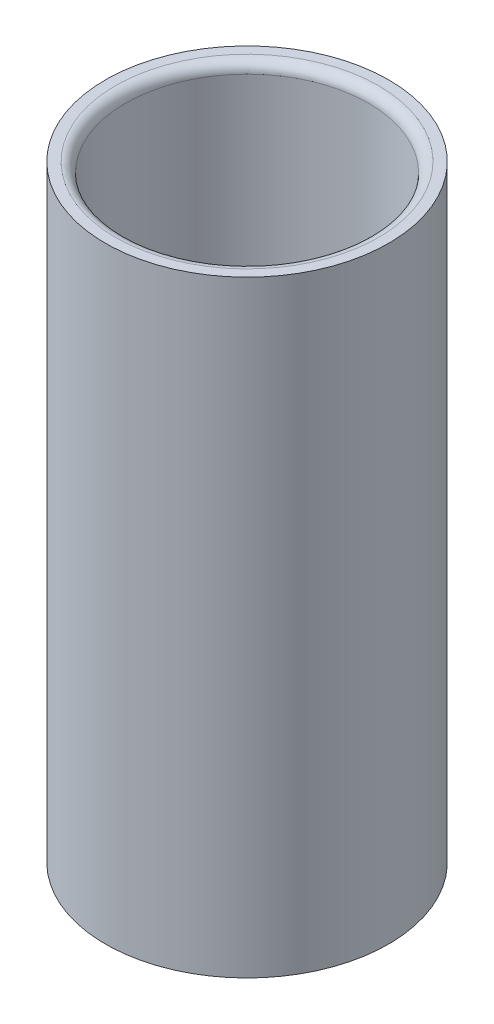
ISO-10303-21;
HEADER;
FILE_DESCRIPTION(('STEP AP214'),'2;1');
FILE_NAME('part.step','',(''),(''),'','','');
FILE_SCHEMA(('AUTOMOTIVE_DESIGN { 1 0 10303 214 1 1 1 1 }'));
ENDSEC;
DATA;
#1=APPLICATION_CONTEXT('core data for automotive mechanical design processes');
#2=APPLICATION_PROTOCOL_DEFINITION('international standard','automotive_design',2000,#1);
#3=PRODUCT_CONTEXT('',#1,'mechanical');
#4=PRODUCT('Part','Part','',(#3));
#5=PRODUCT_RELATED_PRODUCT_CATEGORY('part','',(#4));
#6=PRODUCT_DEFINITION_FORMATION('','',#4);
#7=PRODUCT_DEFINITION_CONTEXT('part definition',#1,'design');
#8=PRODUCT_DEFINITION('design','',#6,#7);
#9=PRODUCT_DEFINITION_SHAPE('','',#8);
#10=(LENGTH_UNIT() NAMED_UNIT(*) SI_UNIT(.MILLI.,.METRE.));
#11=(NAMED_UNIT(*) PLANE_ANGLE_UNIT() SI_UNIT($,.RADIAN.));
#12=(NAMED_UNIT(*) SI_UNIT($,.STERADIAN.) SOLID_ANGLE_UNIT());
#13=UNCERTAINTY_MEASURE_WITH_UNIT(LENGTH_MEASURE(1.E-05),#10,'distance_accuracy_value','');
#14=(GEOMETRIC_REPRESENTATION_CONTEXT(3) GLOBAL_UNCERTAINTY_ASSIGNED_CONTEXT((#13)) GLOBAL_UNIT_ASSIGNED_CONTEXT((#10,
#11,#12)) REPRESENTATION_CONTEXT('',''));
#15=CARTESIAN_POINT('',(0.,0.,0.));
#16=DIRECTION('',(0.,0.,1.));
#17=DIRECTION('',(1.,0.,0.));
#18=AXIS2_PLACEMENT_3D('',#15,#16,#17);
#19=CARTESIAN_POINT('',(0.,15.,0.));
#20=DIRECTION('',(0.,-1.,0.));
#21=DIRECTION('',(0.,0.,-1.));
#22=AXIS2_PLACEMENT_3D('',#19,#20,#21);
#23=CYLINDRICAL_SURFACE('',#22,3.);
#24=CARTESIAN_POINT('',(0.,14.75,0.));
#25=DIRECTION('',(0.,1.,0.));
#26=DIRECTION('',(0.,0.,1.));
#27=AXIS2_PLACEMENT_3D('',#24,#25,#26);
#28=CIRCLE('',#27,3.);
#29=CARTESIAN_POINT('',(0.,14.75,3.));
#30=VERTEX_POINT('',#29);
#31=EDGE_CURVE('E113',#30,#30,#28,.F.);
#32=ORIENTED_EDGE('',*,*,#31,.F.);
#33=EDGE_LOOP('',(#32));
#34=FACE_BOUND('',#33,.T.);
#35=CARTESIAN_POINT('',(0.,0.25,0.));
#36=DIRECTION('',(0.,1.,0.));
#37=DIRECTION('',(0.,0.,1.));
#38=AXIS2_PLACEMENT_3D('',#35,#36,#37);
#39=CIRCLE('',#38,3.);
#40=CARTESIAN_POINT('',(0.,0.25,3.));
#41=VERTEX_POINT('',#40);
#42=EDGE_CURVE('E53',#41,#41,#39,.T.);
#43=ORIENTED_EDGE('',*,*,#42,.F.);
#44=EDGE_LOOP('',(#43));
#45=FACE_BOUND('',#44,.T.);
#46=ADVANCED_FACE('F15',(#34,#45),#23,.F.);
#47=CARTESIAN_POINT('',(0.,14.75,0.));
#48=DIRECTION('',(0.,1.,0.));
#49=DIRECTION('',(0.,0.,1.));
#50=AXIS2_PLACEMENT_3D('',#47,#48,#49);
#51=TOROIDAL_SURFACE('',#50,3.25,0.25);
#52=ORIENTED_EDGE('',*,*,#31,.T.);
#53=EDGE_LOOP('',(#52));
#54=FACE_BOUND('',#53,.T.);
#55=CARTESIAN_POINT('',(0.,15.,0.));
#56=DIRECTION('',(0.,1.,0.));
#57=DIRECTION('',(0.,0.,1.));
#58=AXIS2_PLACEMENT_3D('',#55,#56,#57);
#59=CIRCLE('',#58,3.25);
#60=CARTESIAN_POINT('',(0.,15.,-3.25));
#61=VERTEX_POINT('',#60);
#62=CARTESIAN_POINT('',(0.,15.,3.25));
#63=VERTEX_POINT('',#62);
#64=EDGE_CURVE('E44',#61,#63,#59,.F.);
#65=ORIENTED_EDGE('',*,*,#64,.F.);
#66=CARTESIAN_POINT('',(0.,15.,0.));
#67=DIRECTION('',(0.,1.,0.));
#68=DIRECTION('',(0.,0.,-1.));
#69=AXIS2_PLACEMENT_3D('',#66,#67,#68);
#70=CIRCLE('',#69,3.25);
#71=EDGE_CURVE('E42',#63,#61,#70,.F.);
#72=ORIENTED_EDGE('',*,*,#71,.F.);
#73=EDGE_LOOP('',(#65,#72));
#74=FACE_BOUND('',#73,.T.);
#75=ADVANCED_FACE('F46',(#54,#74),#51,.T.);
#76=CARTESIAN_POINT('',(0.,0.25,0.));
#77=DIRECTION('',(0.,1.,0.));
#78=DIRECTION('',(0.,0.,1.));
#79=AXIS2_PLACEMENT_3D('',#76,#77,#78);
#80=TOROIDAL_SURFACE('',#79,3.25,0.25);
#81=CARTESIAN_POINT('',(0.,0.,0.));
#82=DIRECTION('',(0.,-1.,0.));
#83=DIRECTION('',(0.,0.,1.));
#84=AXIS2_PLACEMENT_3D('',#81,#82,#83);
#85=CIRCLE('',#84,3.25);
#86=CARTESIAN_POINT('',(0.,0.,3.25));
#87=VERTEX_POINT('',#86);
#88=CARTESIAN_POINT('',(0.,0.,-3.25));
#89=VERTEX_POINT('',#88);
#90=EDGE_CURVE('E33',#87,#89,#85,.T.);
#91=ORIENTED_EDGE('',*,*,#90,.T.);
#92=CARTESIAN_POINT('',(0.,0.,0.));
#93=DIRECTION('',(0.,-1.,0.));
#94=DIRECTION('',(0.,0.,-1.));
#95=AXIS2_PLACEMENT_3D('',#92,#93,#94);
#96=CIRCLE('',#95,3.25);
#97=EDGE_CURVE('E90',#89,#87,#96,.T.);
#98=ORIENTED_EDGE('',*,*,#97,.T.);
#99=EDGE_LOOP('',(#91,#98));
#100=FACE_BOUND('',#99,.T.);
#101=ORIENTED_EDGE('',*,*,#42,.T.);
#102=EDGE_LOOP('',(#101));
#103=FACE_BOUND('',#102,.T.);
#104=ADVANCED_FACE('F73',(#100,#103),#80,.T.);
#105=CARTESIAN_POINT('',(0.,15.,0.));
#106=DIRECTION('',(0.,1.,0.));
#107=DIRECTION('',(0.,0.,1.));
#108=AXIS2_PLACEMENT_3D('',#105,#106,#107);
#109=PLANE('',#108);
#110=CARTESIAN_POINT('',(0.,15.,0.));
#111=DIRECTION('',(0.,-1.,0.));
#112=DIRECTION('',(0.,0.,-1.));
#113=AXIS2_PLACEMENT_3D('',#110,#111,#112);
#114=CIRCLE('',#113,3.5);
#115=CARTESIAN_POINT('',(0.,15.,-3.5));
#116=VERTEX_POINT('',#115);
#117=EDGE_CURVE('E25',#116,#116,#114,.T.);
#118=ORIENTED_EDGE('',*,*,#117,.F.);
#119=EDGE_LOOP('',(#118));
#120=FACE_BOUND('',#119,.T.);
#121=ORIENTED_EDGE('',*,*,#71,.T.);
#122=ORIENTED_EDGE('',*,*,#64,.T.);
#123=EDGE_LOOP('',(#121,#122));
#124=FACE_BOUND('',#123,.T.);
#125=ADVANCED_FACE('F52',(#120,#124),#109,.T.);
#126=CARTESIAN_POINT('',(0.,0.,0.));
#127=DIRECTION('',(0.,1.,0.));
#128=DIRECTION('',(0.,0.,1.));
#129=AXIS2_PLACEMENT_3D('',#126,#127,#128);
#130=PLANE('',#129);
#131=CARTESIAN_POINT('',(0.,0.,0.));
#132=DIRECTION('',(0.,-1.,0.));
#133=DIRECTION('',(0.,0.,-1.));
#134=AXIS2_PLACEMENT_3D('',#131,#132,#133);
#135=CIRCLE('',#134,3.5);
#136=CARTESIAN_POINT('',(0.,0.,-3.5));
#137=VERTEX_POINT('',#136);
#138=EDGE_CURVE('E10',#137,#137,#135,.F.);
#139=ORIENTED_EDGE('',*,*,#138,.F.);
#140=EDGE_LOOP('',(#139));
#141=FACE_BOUND('',#140,.T.);
#142=ORIENTED_EDGE('',*,*,#90,.F.);
#143=ORIENTED_EDGE('',*,*,#97,.F.);
#144=EDGE_LOOP('',(#142,#143));
#145=FACE_BOUND('',#144,.T.);
#146=ADVANCED_FACE('F72',(#141,#145),#130,.F.);
#147=CARTESIAN_POINT('',(0.,15.,0.));
#148=DIRECTION('',(0.,-1.,0.));
#149=DIRECTION('',(0.,0.,-1.));
#150=AXIS2_PLACEMENT_3D('',#147,#148,#149);
#151=CYLINDRICAL_SURFACE('',#150,3.5);
#152=ORIENTED_EDGE('',*,*,#138,.T.);
#153=EDGE_LOOP('',(#152));
#154=FACE_BOUND('',#153,.T.);
#155=ORIENTED_EDGE('',*,*,#117,.T.);
#156=EDGE_LOOP('',(#155));
#157=FACE_BOUND('',#156,.T.);
#158=ADVANCED_FACE('F127',(#154,#157),#151,.T.);
#159=CLOSED_SHELL('',(#46,#75,#104,#125,#146,#158));
#160=MANIFOLD_SOLID_BREP('B1',#159);
#161=ADVANCED_BREP_SHAPE_REPRESENTATION('',(#18,#160),#14);
#162=SHAPE_DEFINITION_REPRESENTATION(#9,#161);
ENDSEC;
END-ISO-10303-21;
